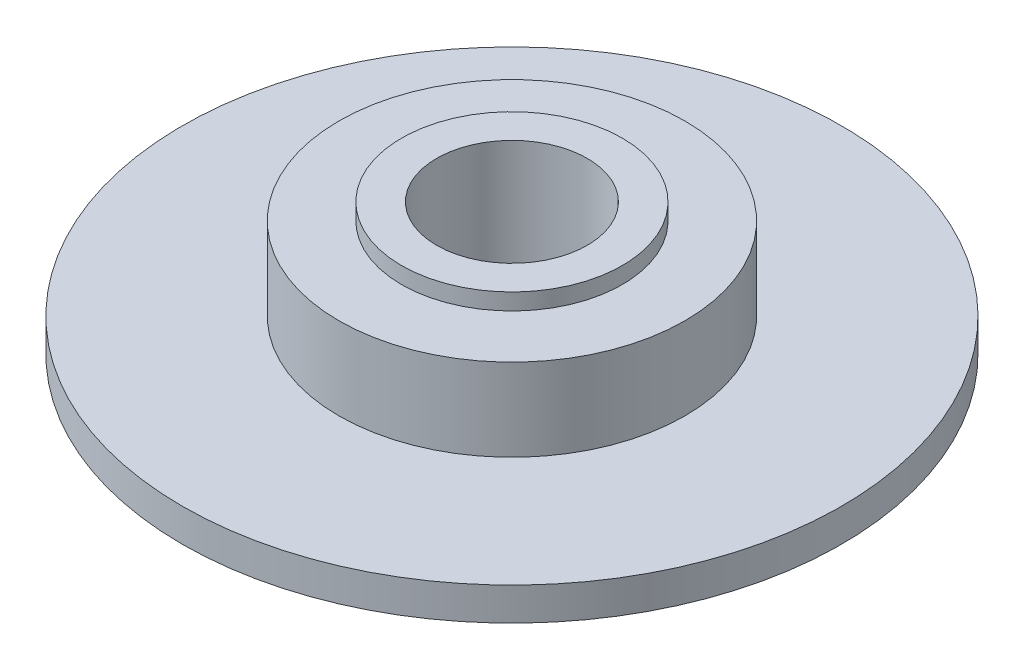
ISO-10303-21;
HEADER;
FILE_DESCRIPTION(('STEP AP214'),'2;1');
FILE_NAME('part.step','',(''),(''),'','','');
FILE_SCHEMA(('AUTOMOTIVE_DESIGN { 1 0 10303 214 1 1 1 1 }'));
ENDSEC;
DATA;
#1=APPLICATION_CONTEXT('core data for automotive mechanical design processes');
#2=APPLICATION_PROTOCOL_DEFINITION('international standard','automotive_design',2000,#1);
#3=PRODUCT_CONTEXT('',#1,'mechanical');
#4=PRODUCT('Part','Part','',(#3));
#5=PRODUCT_RELATED_PRODUCT_CATEGORY('part','',(#4));
#6=PRODUCT_DEFINITION_FORMATION('','',#4);
#7=PRODUCT_DEFINITION_CONTEXT('part definition',#1,'design');
#8=PRODUCT_DEFINITION('design','',#6,#7);
#9=PRODUCT_DEFINITION_SHAPE('','',#8);
#10=(LENGTH_UNIT() NAMED_UNIT(*) SI_UNIT(.MILLI.,.METRE.));
#11=(NAMED_UNIT(*) PLANE_ANGLE_UNIT() SI_UNIT($,.RADIAN.));
#12=(NAMED_UNIT(*) SI_UNIT($,.STERADIAN.) SOLID_ANGLE_UNIT());
#13=UNCERTAINTY_MEASURE_WITH_UNIT(LENGTH_MEASURE(1.E-05),#10,'distance_accuracy_value','');
#14=(GEOMETRIC_REPRESENTATION_CONTEXT(3) GLOBAL_UNCERTAINTY_ASSIGNED_CONTEXT((#13)) GLOBAL_UNIT_ASSIGNED_CONTEXT((#10,
#11,#12)) REPRESENTATION_CONTEXT('',''));
#15=CARTESIAN_POINT('',(0.,0.,0.));
#16=DIRECTION('',(0.,0.,1.));
#17=DIRECTION('',(1.,0.,0.));
#18=AXIS2_PLACEMENT_3D('',#15,#16,#17);
#19=CARTESIAN_POINT('',(0.,7.,0.));
#20=DIRECTION('',(0.,1.,0.));
#21=DIRECTION('',(0.,0.,1.));
#22=AXIS2_PLACEMENT_3D('',#19,#20,#21);
#23=PLANE('',#22);
#24=CARTESIAN_POINT('',(0.,7.,0.));
#25=DIRECTION('',(0.,1.,0.));
#26=DIRECTION('',(0.,0.,1.));
#27=AXIS2_PLACEMENT_3D('',#24,#25,#26);
#28=CIRCLE('',#27,10.5);
#29=CARTESIAN_POINT('',(0.,7.,10.5));
#30=VERTEX_POINT('',#29);
#31=EDGE_CURVE('E46',#30,#30,#28,.T.);
#32=ORIENTED_EDGE('',*,*,#31,.T.);
#33=EDGE_LOOP('',(#32));
#34=FACE_BOUND('',#33,.T.);
#35=CARTESIAN_POINT('',(0.,7.,0.));
#36=DIRECTION('',(0.,1.,0.));
#37=DIRECTION('',(0.,0.,1.));
#38=AXIS2_PLACEMENT_3D('',#35,#36,#37);
#39=CIRCLE('',#38,6.7);
#40=CARTESIAN_POINT('',(0.,7.,6.7));
#41=VERTEX_POINT('',#40);
#42=EDGE_CURVE('E53',#41,#41,#39,.T.);
#43=ORIENTED_EDGE('',*,*,#42,.F.);
#44=EDGE_LOOP('',(#43));
#45=FACE_BOUND('',#44,.T.);
#46=ADVANCED_FACE('F31',(#34,#45),#23,.T.);
#47=CARTESIAN_POINT('',(0.,2.,0.));
#48=DIRECTION('',(0.,1.,0.));
#49=DIRECTION('',(0.,0.,1.));
#50=AXIS2_PLACEMENT_3D('',#47,#48,#49);
#51=PLANE('',#50);
#52=CARTESIAN_POINT('',(0.,2.,0.));
#53=DIRECTION('',(0.,1.,0.));
#54=DIRECTION('',(0.,0.,1.));
#55=AXIS2_PLACEMENT_3D('',#52,#53,#54);
#56=CIRCLE('',#55,20.);
#57=CARTESIAN_POINT('',(0.,2.,20.));
#58=VERTEX_POINT('',#57);
#59=EDGE_CURVE('E10',#58,#58,#56,.T.);
#60=ORIENTED_EDGE('',*,*,#59,.T.);
#61=EDGE_LOOP('',(#60));
#62=FACE_BOUND('',#61,.T.);
#63=CARTESIAN_POINT('',(0.,2.,0.));
#64=DIRECTION('',(0.,1.,0.));
#65=DIRECTION('',(0.,0.,1.));
#66=AXIS2_PLACEMENT_3D('',#63,#64,#65);
#67=CIRCLE('',#66,10.5);
#68=CARTESIAN_POINT('',(0.,2.,10.5));
#69=VERTEX_POINT('',#68);
#70=EDGE_CURVE('E47',#69,#69,#67,.T.);
#71=ORIENTED_EDGE('',*,*,#70,.F.);
#72=EDGE_LOOP('',(#71));
#73=FACE_BOUND('',#72,.T.);
#74=ADVANCED_FACE('F79',(#62,#73),#51,.T.);
#75=CARTESIAN_POINT('',(0.,0.,0.));
#76=DIRECTION('',(0.,1.,0.));
#77=DIRECTION('',(0.,0.,1.));
#78=AXIS2_PLACEMENT_3D('',#75,#76,#77);
#79=PLANE('',#78);
#80=CARTESIAN_POINT('',(0.,0.,0.));
#81=DIRECTION('',(0.,1.,0.));
#82=DIRECTION('',(0.,0.,1.));
#83=AXIS2_PLACEMENT_3D('',#80,#81,#82);
#84=CIRCLE('',#83,20.);
#85=CARTESIAN_POINT('',(0.,0.,20.));
#86=VERTEX_POINT('',#85);
#87=EDGE_CURVE('E35',#86,#86,#84,.T.);
#88=ORIENTED_EDGE('',*,*,#87,.F.);
#89=EDGE_LOOP('',(#88));
#90=FACE_BOUND('',#89,.T.);
#91=CARTESIAN_POINT('',(0.,0.,0.));
#92=DIRECTION('',(0.,1.,0.));
#93=DIRECTION('',(0.,0.,1.));
#94=AXIS2_PLACEMENT_3D('',#91,#92,#93);
#95=CIRCLE('',#94,4.572);
#96=CARTESIAN_POINT('',(0.,0.,4.572));
#97=VERTEX_POINT('',#96);
#98=EDGE_CURVE('E42',#97,#97,#95,.T.);
#99=ORIENTED_EDGE('',*,*,#98,.T.);
#100=EDGE_LOOP('',(#99));
#101=FACE_BOUND('',#100,.T.);
#102=ADVANCED_FACE('F85',(#90,#101),#79,.F.);
#103=CARTESIAN_POINT('',(0.,2.,0.));
#104=DIRECTION('',(0.,-1.,0.));
#105=DIRECTION('',(0.,0.,-1.));
#106=AXIS2_PLACEMENT_3D('',#103,#104,#105);
#107=CYLINDRICAL_SURFACE('',#106,20.);
#108=ORIENTED_EDGE('',*,*,#59,.F.);
#109=EDGE_LOOP('',(#108));
#110=FACE_BOUND('',#109,.T.);
#111=ORIENTED_EDGE('',*,*,#87,.T.);
#112=EDGE_LOOP('',(#111));
#113=FACE_BOUND('',#112,.T.);
#114=ADVANCED_FACE('F33',(#110,#113),#107,.T.);
#115=CARTESIAN_POINT('',(0.,2.,0.));
#116=DIRECTION('',(0.,-1.,0.));
#117=DIRECTION('',(0.,0.,-1.));
#118=AXIS2_PLACEMENT_3D('',#115,#116,#117);
#119=CYLINDRICAL_SURFACE('',#118,4.572);
#120=ORIENTED_EDGE('',*,*,#98,.F.);
#121=EDGE_LOOP('',(#120));
#122=FACE_BOUND('',#121,.T.);
#123=CARTESIAN_POINT('',(0.,8.,0.));
#124=DIRECTION('',(0.,1.,0.));
#125=DIRECTION('',(0.,0.,1.));
#126=AXIS2_PLACEMENT_3D('',#123,#124,#125);
#127=CIRCLE('',#126,4.572);
#128=CARTESIAN_POINT('',(0.,8.,4.572));
#129=VERTEX_POINT('',#128);
#130=EDGE_CURVE('E56',#129,#129,#127,.T.);
#131=ORIENTED_EDGE('',*,*,#130,.T.);
#132=EDGE_LOOP('',(#131));
#133=FACE_BOUND('',#132,.T.);
#134=ADVANCED_FACE('F62',(#122,#133),#119,.F.);
#135=CARTESIAN_POINT('',(0.,7.,0.));
#136=DIRECTION('',(0.,-1.,0.));
#137=DIRECTION('',(0.,0.,-1.));
#138=AXIS2_PLACEMENT_3D('',#135,#136,#137);
#139=CYLINDRICAL_SURFACE('',#138,10.5);
#140=ORIENTED_EDGE('',*,*,#31,.F.);
#141=EDGE_LOOP('',(#140));
#142=FACE_BOUND('',#141,.T.);
#143=ORIENTED_EDGE('',*,*,#70,.T.);
#144=EDGE_LOOP('',(#143));
#145=FACE_BOUND('',#144,.T.);
#146=ADVANCED_FACE('F67',(#142,#145),#139,.T.);
#147=CARTESIAN_POINT('',(0.,8.,0.));
#148=DIRECTION('',(0.,1.,0.));
#149=DIRECTION('',(0.,0.,1.));
#150=AXIS2_PLACEMENT_3D('',#147,#148,#149);
#151=PLANE('',#150);
#152=CARTESIAN_POINT('',(0.,8.,0.));
#153=DIRECTION('',(0.,1.,0.));
#154=DIRECTION('',(0.,0.,1.));
#155=AXIS2_PLACEMENT_3D('',#152,#153,#154);
#156=CIRCLE('',#155,6.7);
#157=CARTESIAN_POINT('',(0.,8.,6.7));
#158=VERTEX_POINT('',#157);
#159=EDGE_CURVE('E50',#158,#158,#156,.T.);
#160=ORIENTED_EDGE('',*,*,#159,.T.);
#161=EDGE_LOOP('',(#160));
#162=FACE_BOUND('',#161,.T.);
#163=ORIENTED_EDGE('',*,*,#130,.F.);
#164=EDGE_LOOP('',(#163));
#165=FACE_BOUND('',#164,.T.);
#166=ADVANCED_FACE('F64',(#162,#165),#151,.T.);
#167=CARTESIAN_POINT('',(0.,8.,0.));
#168=DIRECTION('',(0.,-1.,0.));
#169=DIRECTION('',(0.,0.,-1.));
#170=AXIS2_PLACEMENT_3D('',#167,#168,#169);
#171=CYLINDRICAL_SURFACE('',#170,6.7);
#172=ORIENTED_EDGE('',*,*,#159,.F.);
#173=EDGE_LOOP('',(#172));
#174=FACE_BOUND('',#173,.T.);
#175=ORIENTED_EDGE('',*,*,#42,.T.);
#176=EDGE_LOOP('',(#175));
#177=FACE_BOUND('',#176,.T.);
#178=ADVANCED_FACE('F66',(#174,#177),#171,.T.);
#179=CLOSED_SHELL('',(#46,#74,#102,#114,#134,#146,#166,#178));
#180=MANIFOLD_SOLID_BREP('B2',#179);
#181=ADVANCED_BREP_SHAPE_REPRESENTATION('',(#18,#180),#14);
#182=SHAPE_DEFINITION_REPRESENTATION(#9,#181);
ENDSEC;
END-ISO-10303-21;
